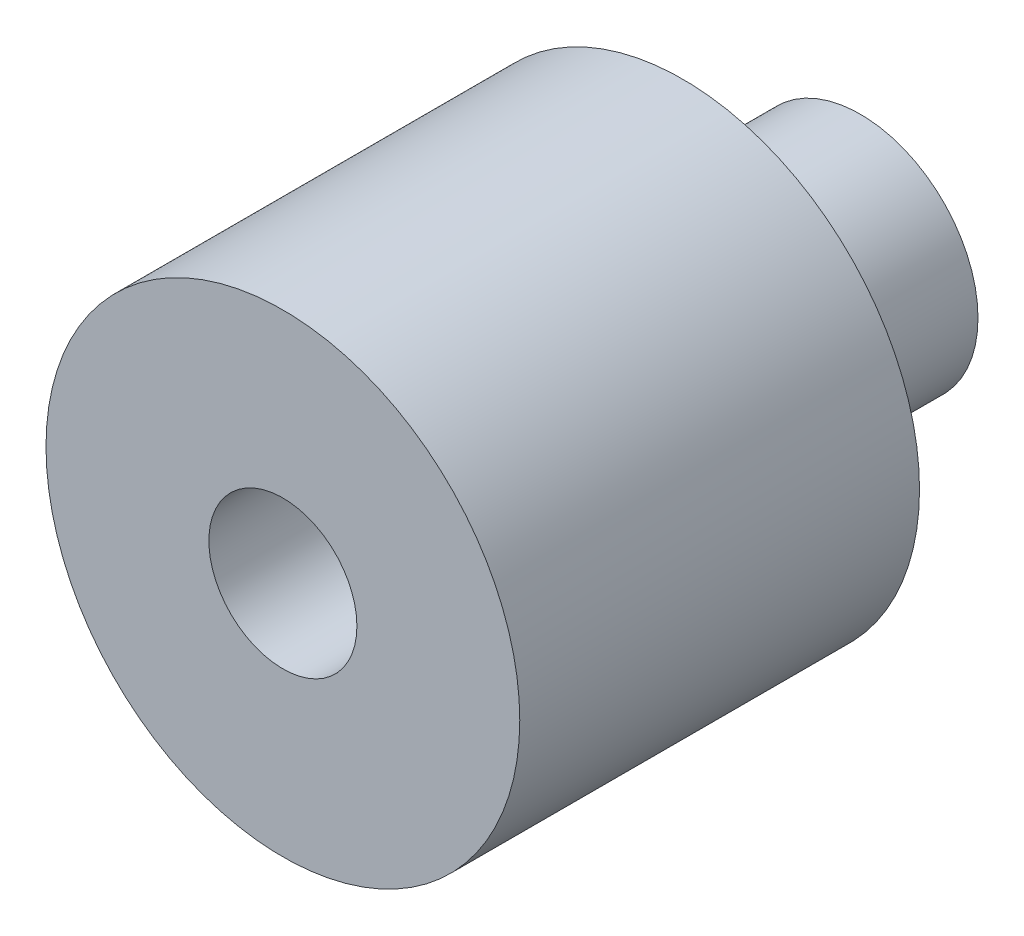
ISO-10303-21;
HEADER;
FILE_DESCRIPTION(('STEP AP214'),'2;1');
FILE_NAME('part.step','',(''),(''),'','','');
FILE_SCHEMA(('AUTOMOTIVE_DESIGN { 1 0 10303 214 1 1 1 1 }'));
ENDSEC;
DATA;
#1=APPLICATION_CONTEXT('core data for automotive mechanical design processes');
#2=APPLICATION_PROTOCOL_DEFINITION('international standard','automotive_design',2000,#1);
#3=PRODUCT_CONTEXT('',#1,'mechanical');
#4=PRODUCT('Part','Part','',(#3));
#5=PRODUCT_RELATED_PRODUCT_CATEGORY('part','',(#4));
#6=PRODUCT_DEFINITION_FORMATION('','',#4);
#7=PRODUCT_DEFINITION_CONTEXT('part definition',#1,'design');
#8=PRODUCT_DEFINITION('design','',#6,#7);
#9=PRODUCT_DEFINITION_SHAPE('','',#8);
#10=(LENGTH_UNIT() NAMED_UNIT(*) SI_UNIT(.MILLI.,.METRE.));
#11=(NAMED_UNIT(*) PLANE_ANGLE_UNIT() SI_UNIT($,.RADIAN.));
#12=(NAMED_UNIT(*) SI_UNIT($,.STERADIAN.) SOLID_ANGLE_UNIT());
#13=UNCERTAINTY_MEASURE_WITH_UNIT(LENGTH_MEASURE(1.E-05),#10,'distance_accuracy_value','');
#14=(GEOMETRIC_REPRESENTATION_CONTEXT(3) GLOBAL_UNCERTAINTY_ASSIGNED_CONTEXT((#13)) GLOBAL_UNIT_ASSIGNED_CONTEXT((#10,
#11,#12)) REPRESENTATION_CONTEXT('',''));
#15=CARTESIAN_POINT('',(0.,0.,0.));
#16=DIRECTION('',(0.,0.,1.));
#17=DIRECTION('',(1.,0.,0.));
#18=AXIS2_PLACEMENT_3D('',#15,#16,#17);
#19=CARTESIAN_POINT('',(0.,0.,13.5));
#20=DIRECTION('',(0.,0.,-1.));
#21=DIRECTION('',(-1.,0.,0.));
#22=AXIS2_PLACEMENT_3D('',#19,#20,#21);
#23=CYLINDRICAL_SURFACE('',#22,8.);
#24=CARTESIAN_POINT('',(0.,0.,13.5));
#25=DIRECTION('',(0.,0.,1.));
#26=DIRECTION('',(1.,0.,0.));
#27=AXIS2_PLACEMENT_3D('',#24,#25,#26);
#28=CIRCLE('',#27,8.);
#29=CARTESIAN_POINT('',(8.,0.,13.5));
#30=VERTEX_POINT('',#29);
#31=EDGE_CURVE('E53',#30,#30,#28,.T.);
#32=ORIENTED_EDGE('',*,*,#31,.F.);
#33=EDGE_LOOP('',(#32));
#34=FACE_BOUND('',#33,.T.);
#35=CARTESIAN_POINT('',(0.,0.,0.));
#36=DIRECTION('',(0.,0.,1.));
#37=DIRECTION('',(1.,0.,0.));
#38=AXIS2_PLACEMENT_3D('',#35,#36,#37);
#39=CIRCLE('',#38,8.);
#40=CARTESIAN_POINT('',(8.,0.,0.));
#41=VERTEX_POINT('',#40);
#42=EDGE_CURVE('E48',#41,#41,#39,.T.);
#43=ORIENTED_EDGE('',*,*,#42,.T.);
#44=EDGE_LOOP('',(#43));
#45=FACE_BOUND('',#44,.T.);
#46=ADVANCED_FACE('F45',(#34,#45),#23,.T.);
#47=CARTESIAN_POINT('',(0.,0.,13.5));
#48=DIRECTION('',(0.,0.,1.));
#49=DIRECTION('',(1.,0.,0.));
#50=AXIS2_PLACEMENT_3D('',#47,#48,#49);
#51=PLANE('',#50);
#52=CARTESIAN_POINT('',(0.,0.,13.5));
#53=DIRECTION('',(0.,0.,1.));
#54=DIRECTION('',(1.,0.,0.));
#55=AXIS2_PLACEMENT_3D('',#52,#53,#54);
#56=CIRCLE('',#55,2.5);
#57=CARTESIAN_POINT('',(2.5,0.,13.5));
#58=VERTEX_POINT('',#57);
#59=EDGE_CURVE('E65',#58,#58,#56,.T.);
#60=ORIENTED_EDGE('',*,*,#59,.F.);
#61=EDGE_LOOP('',(#60));
#62=FACE_BOUND('',#61,.T.);
#63=ORIENTED_EDGE('',*,*,#31,.T.);
#64=EDGE_LOOP('',(#63));
#65=FACE_BOUND('',#64,.T.);
#66=ADVANCED_FACE('F104',(#62,#65),#51,.T.);
#67=CARTESIAN_POINT('',(0.,0.,0.));
#68=DIRECTION('',(0.,0.,1.));
#69=DIRECTION('',(1.,0.,0.));
#70=AXIS2_PLACEMENT_3D('',#67,#68,#69);
#71=PLANE('',#70);
#72=CARTESIAN_POINT('',(0.,0.,0.));
#73=DIRECTION('',(0.,0.,-1.));
#74=DIRECTION('',(-1.,0.,0.));
#75=AXIS2_PLACEMENT_3D('',#72,#73,#74);
#76=CIRCLE('',#75,3.975);
#77=CARTESIAN_POINT('',(-3.975,0.,0.));
#78=VERTEX_POINT('',#77);
#79=EDGE_CURVE('E10',#78,#78,#76,.T.);
#80=ORIENTED_EDGE('',*,*,#79,.F.);
#81=EDGE_LOOP('',(#80));
#82=FACE_BOUND('',#81,.T.);
#83=ORIENTED_EDGE('',*,*,#42,.F.);
#84=EDGE_LOOP('',(#83));
#85=FACE_BOUND('',#84,.T.);
#86=ADVANCED_FACE('F99',(#82,#85),#71,.F.);
#87=CARTESIAN_POINT('',(0.,0.,-6.));
#88=DIRECTION('',(0.,0.,1.));
#89=DIRECTION('',(1.,0.,0.));
#90=AXIS2_PLACEMENT_3D('',#87,#88,#89);
#91=CYLINDRICAL_SURFACE('',#90,3.975);
#92=CARTESIAN_POINT('',(0.,0.,-6.));
#93=DIRECTION('',(0.,0.,-1.));
#94=DIRECTION('',(-1.,0.,0.));
#95=AXIS2_PLACEMENT_3D('',#92,#93,#94);
#96=CIRCLE('',#95,3.975);
#97=CARTESIAN_POINT('',(-3.975,0.,-6.));
#98=VERTEX_POINT('',#97);
#99=EDGE_CURVE('E60',#98,#98,#96,.T.);
#100=ORIENTED_EDGE('',*,*,#99,.F.);
#101=EDGE_LOOP('',(#100));
#102=FACE_BOUND('',#101,.T.);
#103=ORIENTED_EDGE('',*,*,#79,.T.);
#104=EDGE_LOOP('',(#103));
#105=FACE_BOUND('',#104,.T.);
#106=ADVANCED_FACE('F94',(#102,#105),#91,.T.);
#107=CARTESIAN_POINT('',(0.,0.,-6.));
#108=DIRECTION('',(0.,0.,-1.));
#109=DIRECTION('',(-1.,0.,0.));
#110=AXIS2_PLACEMENT_3D('',#107,#108,#109);
#111=PLANE('',#110);
#112=CARTESIAN_POINT('',(0.,0.,-6.));
#113=DIRECTION('',(0.,0.,-1.));
#114=DIRECTION('',(-1.,0.,0.));
#115=AXIS2_PLACEMENT_3D('',#112,#113,#114);
#116=CIRCLE('',#115,2.);
#117=CARTESIAN_POINT('',(-2.,0.,-6.));
#118=VERTEX_POINT('',#117);
#119=EDGE_CURVE('E73',#118,#118,#116,.T.);
#120=ORIENTED_EDGE('',*,*,#119,.F.);
#121=EDGE_LOOP('',(#120));
#122=FACE_BOUND('',#121,.T.);
#123=ORIENTED_EDGE('',*,*,#99,.T.);
#124=EDGE_LOOP('',(#123));
#125=FACE_BOUND('',#124,.T.);
#126=ADVANCED_FACE('F90',(#122,#125),#111,.T.);
#127=CARTESIAN_POINT('',(0.,0.,0.499999999999999));
#128=DIRECTION('',(0.,0.,1.));
#129=DIRECTION('',(1.,0.,0.));
#130=AXIS2_PLACEMENT_3D('',#127,#128,#129);
#131=CYLINDRICAL_SURFACE('',#130,2.5);
#132=CARTESIAN_POINT('',(0.,0.,0.499999999999999));
#133=DIRECTION('',(0.,0.,1.));
#134=DIRECTION('',(1.,0.,0.));
#135=AXIS2_PLACEMENT_3D('',#132,#133,#134);
#136=CIRCLE('',#135,2.5);
#137=CARTESIAN_POINT('',(2.5,0.,0.499999999999999));
#138=VERTEX_POINT('',#137);
#139=EDGE_CURVE('E64',#138,#138,#136,.T.);
#140=ORIENTED_EDGE('',*,*,#139,.F.);
#141=EDGE_LOOP('',(#140));
#142=FACE_BOUND('',#141,.T.);
#143=ORIENTED_EDGE('',*,*,#59,.T.);
#144=EDGE_LOOP('',(#143));
#145=FACE_BOUND('',#144,.T.);
#146=ADVANCED_FACE('F93',(#142,#145),#131,.F.);
#147=CARTESIAN_POINT('',(0.,0.,0.499999999999999));
#148=DIRECTION('',(0.,0.,1.));
#149=DIRECTION('',(1.,0.,0.));
#150=AXIS2_PLACEMENT_3D('',#147,#148,#149);
#151=PLANE('',#150);
#152=ORIENTED_EDGE('',*,*,#139,.T.);
#153=EDGE_LOOP('',(#152));
#154=FACE_BOUND('',#153,.T.);
#155=ADVANCED_FACE('F86',(#154),#151,.T.);
#156=CARTESIAN_POINT('',(0.,0.,-1.));
#157=DIRECTION('',(0.,0.,-1.));
#158=DIRECTION('',(-1.,0.,0.));
#159=AXIS2_PLACEMENT_3D('',#156,#157,#158);
#160=CYLINDRICAL_SURFACE('',#159,2.);
#161=CARTESIAN_POINT('',(0.,0.,-1.));
#162=DIRECTION('',(0.,0.,-1.));
#163=DIRECTION('',(-1.,0.,0.));
#164=AXIS2_PLACEMENT_3D('',#161,#162,#163);
#165=CIRCLE('',#164,2.);
#166=CARTESIAN_POINT('',(-2.,0.,-1.));
#167=VERTEX_POINT('',#166);
#168=EDGE_CURVE('E69',#167,#167,#165,.T.);
#169=ORIENTED_EDGE('',*,*,#168,.F.);
#170=EDGE_LOOP('',(#169));
#171=FACE_BOUND('',#170,.T.);
#172=ORIENTED_EDGE('',*,*,#119,.T.);
#173=EDGE_LOOP('',(#172));
#174=FACE_BOUND('',#173,.T.);
#175=ADVANCED_FACE('F83',(#171,#174),#160,.F.);
#176=CARTESIAN_POINT('',(0.,0.,-1.));
#177=DIRECTION('',(0.,0.,-1.));
#178=DIRECTION('',(-1.,0.,0.));
#179=AXIS2_PLACEMENT_3D('',#176,#177,#178);
#180=PLANE('',#179);
#181=ORIENTED_EDGE('',*,*,#168,.T.);
#182=EDGE_LOOP('',(#181));
#183=FACE_BOUND('',#182,.T.);
#184=ADVANCED_FACE('F81',(#183),#180,.T.);
#185=CLOSED_SHELL('',(#46,#66,#86,#106,#126,#146,#155,#175,#184));
#186=MANIFOLD_SOLID_BREP('B2',#185);
#187=ADVANCED_BREP_SHAPE_REPRESENTATION('',(#18,#186),#14);
#188=SHAPE_DEFINITION_REPRESENTATION(#9,#187);
ENDSEC;
END-ISO-10303-21;
